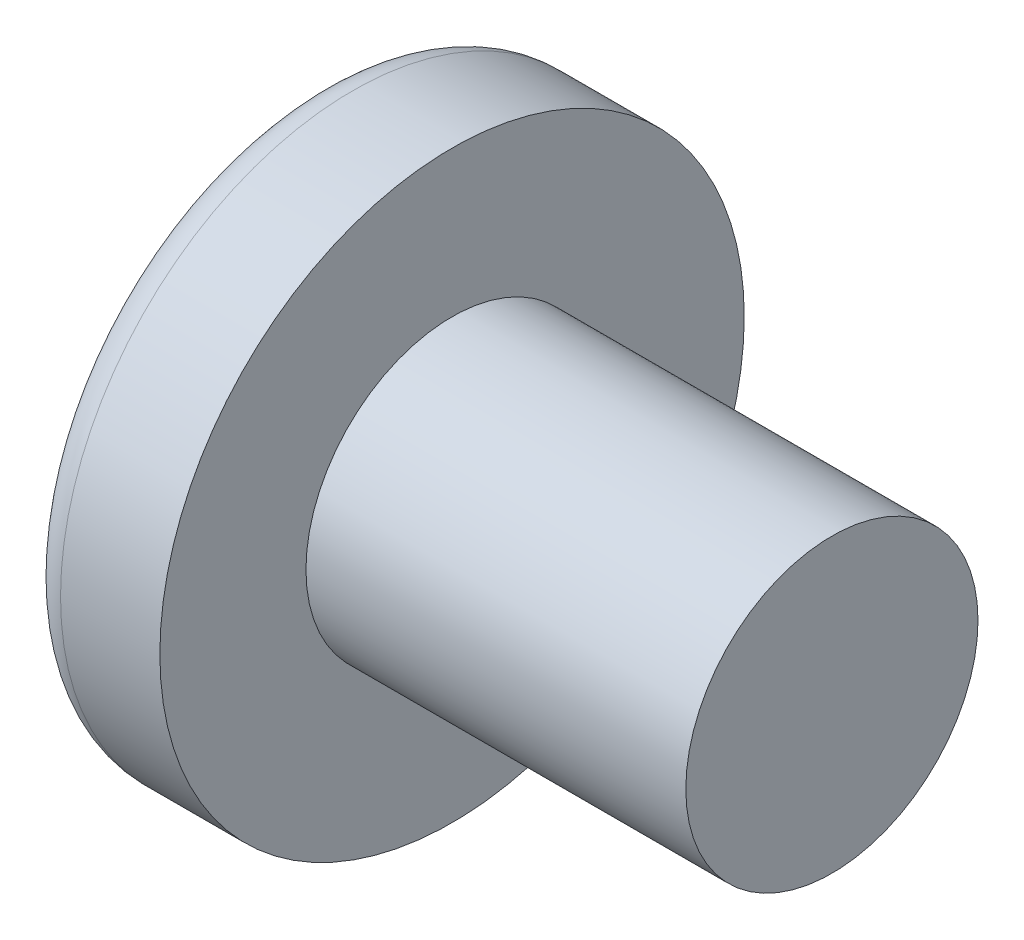
ISO-10303-21;
HEADER;
FILE_DESCRIPTION(('STEP AP214'),'2;1');
FILE_NAME('part.step','',(''),(''),'','','');
FILE_SCHEMA(('AUTOMOTIVE_DESIGN { 1 0 10303 214 1 1 1 1 }'));
ENDSEC;
DATA;
#1=APPLICATION_CONTEXT('core data for automotive mechanical design processes');
#2=APPLICATION_PROTOCOL_DEFINITION('international standard','automotive_design',2000,#1);
#3=PRODUCT_CONTEXT('',#1,'mechanical');
#4=PRODUCT('Part','Part','',(#3));
#5=PRODUCT_RELATED_PRODUCT_CATEGORY('part','',(#4));
#6=PRODUCT_DEFINITION_FORMATION('','',#4);
#7=PRODUCT_DEFINITION_CONTEXT('part definition',#1,'design');
#8=PRODUCT_DEFINITION('design','',#6,#7);
#9=PRODUCT_DEFINITION_SHAPE('','',#8);
#10=(LENGTH_UNIT() NAMED_UNIT(*) SI_UNIT(.MILLI.,.METRE.));
#11=(NAMED_UNIT(*) PLANE_ANGLE_UNIT() SI_UNIT($,.RADIAN.));
#12=(NAMED_UNIT(*) SI_UNIT($,.STERADIAN.) SOLID_ANGLE_UNIT());
#13=UNCERTAINTY_MEASURE_WITH_UNIT(LENGTH_MEASURE(1.E-05),#10,'distance_accuracy_value','');
#14=(GEOMETRIC_REPRESENTATION_CONTEXT(3) GLOBAL_UNCERTAINTY_ASSIGNED_CONTEXT((#13)) GLOBAL_UNIT_ASSIGNED_CONTEXT((#10,
#11,#12)) REPRESENTATION_CONTEXT('',''));
#15=CARTESIAN_POINT('',(0.,0.,0.));
#16=DIRECTION('',(0.,0.,1.));
#17=DIRECTION('',(1.,0.,0.));
#18=AXIS2_PLACEMENT_3D('',#15,#16,#17);
#19=CARTESIAN_POINT('',(16.,0.,0.));
#20=DIRECTION('',(-1.,0.,0.));
#21=DIRECTION('',(0.,1.,0.));
#22=AXIS2_PLACEMENT_3D('',#19,#20,#21);
#23=SPHERICAL_SURFACE('',#22,16.);
#24=CARTESIAN_POINT('',(3.1355893789029,0.,0.));
#25=DIRECTION('',(-1.,0.,0.));
#26=DIRECTION('',(0.,0.,1.));
#27=AXIS2_PLACEMENT_3D('',#24,#25,#26);
#28=CIRCLE('',#27,9.51351351351351);
#29=CARTESIAN_POINT('',(3.1355893789029,0.,9.51351351351351));
#30=VERTEX_POINT('',#29);
#31=EDGE_CURVE('E152',#30,#30,#28,.T.);
#32=ORIENTED_EDGE('',*,*,#31,.T.);
#33=EDGE_LOOP('',(#32));
#34=FACE_BOUND('',#33,.T.);
#35=CARTESIAN_POINT('',(15.9783292627018,-0.286901717708185,0.));
#36=DIRECTION('',(-0.0753191069988102,-0.997159481788596,0.));
#37=DIRECTION('',(0.997159481788596,-0.0753191069988102,0.));
#38=AXIS2_PLACEMENT_3D('',#35,#36,#37);
#39=CIRCLE('',#38,15.9974128465674);
#40=CARTESIAN_POINT('',(0.689797493113337,0.867897069485676,4.56557267764947));
#41=VERTEX_POINT('',#40);
#42=CARTESIAN_POINT('',(0.0525309152497253,0.916032147616602,0.916032147616605));
#43=VERTEX_POINT('',#42);
#44=EDGE_CURVE('E183',#41,#43,#39,.T.);
#45=ORIENTED_EDGE('',*,*,#44,.F.);
#46=CARTESIAN_POINT('',(12.5917266638189,0.,-4.48302043571123));
#47=DIRECTION('',(0.605215831317699,0.,0.796061428234295));
#48=DIRECTION('',(0.796061428234295,0.,-0.605215831317699));
#49=AXIS2_PLACEMENT_3D('',#46,#47,#48);
#50=CIRCLE('',#49,14.9761877872465);
#51=CARTESIAN_POINT('',(0.689797493113337,-0.867897069485708,4.56557267764947));
#52=VERTEX_POINT('',#51);
#53=EDGE_CURVE('E148',#41,#52,#50,.T.);
#54=ORIENTED_EDGE('',*,*,#53,.T.);
#55=CARTESIAN_POINT('',(15.9783292627018,0.286901717708185,0.));
#56=DIRECTION('',(-0.0753191069988102,0.997159481788596,0.));
#57=DIRECTION('',(-0.997159481788596,-0.0753191069988102,0.));
#58=AXIS2_PLACEMENT_3D('',#55,#56,#57);
#59=CIRCLE('',#58,15.9974128465674);
#60=CARTESIAN_POINT('',(0.0525309152497253,-0.916032147616608,0.916032147616605));
#61=VERTEX_POINT('',#60);
#62=EDGE_CURVE('E104',#61,#52,#59,.T.);
#63=ORIENTED_EDGE('',*,*,#62,.F.);
#64=CARTESIAN_POINT('',(15.9783292627018,0.,-0.286901717708185));
#65=DIRECTION('',(-0.0753191069988102,0.,-0.997159481788596));
#66=DIRECTION('',(-0.997159481788596,0.,0.0753191069988102));
#67=AXIS2_PLACEMENT_3D('',#64,#65,#66);
#68=CIRCLE('',#67,15.9974128465674);
#69=CARTESIAN_POINT('',(0.689797493113334,-4.56557267764947,0.867897069485691));
#70=VERTEX_POINT('',#69);
#71=EDGE_CURVE('E129',#70,#61,#68,.T.);
#72=ORIENTED_EDGE('',*,*,#71,.F.);
#73=CARTESIAN_POINT('',(12.5917266638189,4.48302043571123,0.));
#74=DIRECTION('',(0.605215831317699,-0.796061428234295,0.));
#75=DIRECTION('',(0.796061428234295,0.605215831317699,0.));
#76=AXIS2_PLACEMENT_3D('',#73,#74,#75);
#77=CIRCLE('',#76,14.9761877872465);
#78=CARTESIAN_POINT('',(0.689797493113334,-4.56557267764947,-0.867897069485692));
#79=VERTEX_POINT('',#78);
#80=EDGE_CURVE('E137',#70,#79,#77,.T.);
#81=ORIENTED_EDGE('',*,*,#80,.T.);
#82=CARTESIAN_POINT('',(15.9783292627018,0.,0.286901717708185));
#83=DIRECTION('',(-0.0753191069988102,0.,0.997159481788596));
#84=DIRECTION('',(0.997159481788596,0.,0.0753191069988102));
#85=AXIS2_PLACEMENT_3D('',#82,#83,#84);
#86=CIRCLE('',#85,15.9974128465674);
#87=CARTESIAN_POINT('',(0.0525309152497253,-0.916032147616602,-0.916032147616605));
#88=VERTEX_POINT('',#87);
#89=EDGE_CURVE('E47',#88,#79,#86,.T.);
#90=ORIENTED_EDGE('',*,*,#89,.F.);
#91=CARTESIAN_POINT('',(0.689797493113334,-0.867897069485676,-4.56557267764947));
#92=VERTEX_POINT('',#91);
#93=EDGE_CURVE('E190',#92,#88,#59,.T.);
#94=ORIENTED_EDGE('',*,*,#93,.F.);
#95=CARTESIAN_POINT('',(12.5917266638189,0.,4.48302043571123));
#96=DIRECTION('',(0.605215831317699,0.,-0.796061428234295));
#97=DIRECTION('',(-0.796061428234295,0.,-0.605215831317699));
#98=AXIS2_PLACEMENT_3D('',#95,#96,#97);
#99=CIRCLE('',#98,14.9761877872465);
#100=CARTESIAN_POINT('',(0.689797493113334,0.867897069485708,-4.56557267764947));
#101=VERTEX_POINT('',#100);
#102=EDGE_CURVE('E130',#92,#101,#99,.T.);
#103=ORIENTED_EDGE('',*,*,#102,.T.);
#104=CARTESIAN_POINT('',(0.0525309152497253,0.916032147616609,-0.916032147616605));
#105=VERTEX_POINT('',#104);
#106=EDGE_CURVE('E178',#105,#101,#39,.T.);
#107=ORIENTED_EDGE('',*,*,#106,.F.);
#108=CARTESIAN_POINT('',(0.689797493113337,4.56557267764947,-0.867897069485692));
#109=VERTEX_POINT('',#108);
#110=EDGE_CURVE('E40',#109,#105,#86,.T.);
#111=ORIENTED_EDGE('',*,*,#110,.F.);
#112=CARTESIAN_POINT('',(12.5917266638189,-4.48302043571123,0.));
#113=DIRECTION('',(0.605215831317699,0.796061428234295,0.));
#114=DIRECTION('',(-0.796061428234295,0.605215831317699,0.));
#115=AXIS2_PLACEMENT_3D('',#112,#113,#114);
#116=CIRCLE('',#115,14.9761877872465);
#117=CARTESIAN_POINT('',(0.689797493113337,4.56557267764947,0.867897069485692));
#118=VERTEX_POINT('',#117);
#119=EDGE_CURVE('E11',#109,#118,#116,.T.);
#120=ORIENTED_EDGE('',*,*,#119,.T.);
#121=EDGE_CURVE('E166',#43,#118,#68,.T.);
#122=ORIENTED_EDGE('',*,*,#121,.F.);
#123=EDGE_LOOP('',(#45,#54,#63,#72,#81,#90,#94,#103,#107,#111,#120,#122));
#124=FACE_BOUND('',#123,.T.);
#125=ADVANCED_FACE('F32',(#34,#124),#23,.T.);
#126=CARTESIAN_POINT('',(6.69505399568034,0.,-0.414298056155508));
#127=DIRECTION('',(-0.0753191069988102,0.,0.997159481788596));
#128=DIRECTION('',(0.997159481788596,0.,0.0753191069988102));
#129=AXIS2_PLACEMENT_3D('',#126,#127,#128);
#130=PLANE('',#129);
#131=ORIENTED_EDGE('',*,*,#110,.T.);
#132=DIRECTION('',(0.994343032504054,-0.0751063702712425,0.0751063702712422));
#133=VECTOR('',#132,1.);
#134=CARTESIAN_POINT('',(6.72599439429394,0.411961014552512,-0.411961014552511));
#135=LINE('',#134,#133);
#136=CARTESIAN_POINT('',(6.09,0.460000000000002,-0.459999999999998));
#137=VERTEX_POINT('',#136);
#138=EDGE_CURVE('E172',#105,#137,#135,.T.);
#139=ORIENTED_EDGE('',*,*,#138,.T.);
#140=DIRECTION('',(0.794626219349906,-0.60412469549919,0.0600210280625545));
#141=VECTOR('',#140,1.);
#142=CARTESIAN_POINT('',(0.,5.09,-0.92));
#143=LINE('',#142,#141);
#144=EDGE_CURVE('E153',#109,#137,#143,.T.);
#145=ORIENTED_EDGE('',*,*,#144,.F.);
#146=EDGE_LOOP('',(#131,#139,#145));
#147=FACE_BOUND('',#146,.T.);
#148=ADVANCED_FACE('F171',(#147),#130,.T.);
#149=DIRECTION('',(0.794626219349906,0.60412469549919,0.0600210280625545));
#150=VECTOR('',#149,1.);
#151=CARTESIAN_POINT('',(0.,-5.09,-0.92));
#152=LINE('',#151,#150);
#153=CARTESIAN_POINT('',(6.09,-0.46,-0.46));
#154=VERTEX_POINT('',#153);
#155=EDGE_CURVE('E138',#79,#154,#152,.T.);
#156=ORIENTED_EDGE('',*,*,#155,.T.);
#157=DIRECTION('',(-0.994343032504054,-0.0751063702712418,-0.0751063702712422));
#158=VECTOR('',#157,1.);
#159=CARTESIAN_POINT('',(6.72599439429394,-0.411961014552509,-0.411961014552511));
#160=LINE('',#159,#158);
#161=EDGE_CURVE('E193',#154,#88,#160,.T.);
#162=ORIENTED_EDGE('',*,*,#161,.T.);
#163=ORIENTED_EDGE('',*,*,#89,.T.);
#164=EDGE_LOOP('',(#156,#162,#163));
#165=FACE_BOUND('',#164,.T.);
#166=ADVANCED_FACE('F208',(#165),#130,.T.);
#167=CARTESIAN_POINT('',(6.69505399568034,0.,0.414298056155508));
#168=DIRECTION('',(-0.0753191069988102,0.,-0.997159481788596));
#169=DIRECTION('',(-0.997159481788596,0.,0.0753191069988102));
#170=AXIS2_PLACEMENT_3D('',#167,#168,#169);
#171=PLANE('',#170);
#172=DIRECTION('',(0.794626219349906,-0.60412469549919,-0.0600210280625545));
#173=VECTOR('',#172,1.);
#174=CARTESIAN_POINT('',(0.,5.09,0.92));
#175=LINE('',#174,#173);
#176=CARTESIAN_POINT('',(6.09,0.460000000000001,0.46));
#177=VERTEX_POINT('',#176);
#178=EDGE_CURVE('E209',#118,#177,#175,.T.);
#179=ORIENTED_EDGE('',*,*,#178,.T.);
#180=DIRECTION('',(-0.994343032504054,0.0751063702712419,0.0751063702712421));
#181=VECTOR('',#180,1.);
#182=CARTESIAN_POINT('',(6.72599439429394,0.411961014552509,0.411961014552511));
#183=LINE('',#182,#181);
#184=EDGE_CURVE('E187',#177,#43,#183,.T.);
#185=ORIENTED_EDGE('',*,*,#184,.T.);
#186=ORIENTED_EDGE('',*,*,#121,.T.);
#187=EDGE_LOOP('',(#179,#185,#186));
#188=FACE_BOUND('',#187,.T.);
#189=ADVANCED_FACE('F213',(#188),#171,.T.);
#190=ORIENTED_EDGE('',*,*,#71,.T.);
#191=DIRECTION('',(0.994343032504054,0.0751063702712424,-0.0751063702712421));
#192=VECTOR('',#191,1.);
#193=CARTESIAN_POINT('',(6.72599439429394,-0.411961014552512,0.41196101455251));
#194=LINE('',#193,#192);
#195=CARTESIAN_POINT('',(6.09,-0.460000000000002,0.459999999999999));
#196=VERTEX_POINT('',#195);
#197=EDGE_CURVE('E102',#61,#196,#194,.T.);
#198=ORIENTED_EDGE('',*,*,#197,.T.);
#199=DIRECTION('',(0.794626219349906,0.60412469549919,-0.0600210280625544));
#200=VECTOR('',#199,1.);
#201=CARTESIAN_POINT('',(0.,-5.09,0.919999999999999));
#202=LINE('',#201,#200);
#203=EDGE_CURVE('E127',#70,#196,#202,.T.);
#204=ORIENTED_EDGE('',*,*,#203,.F.);
#205=EDGE_LOOP('',(#190,#198,#204));
#206=FACE_BOUND('',#205,.T.);
#207=ADVANCED_FACE('F126',(#206),#171,.T.);
#208=CARTESIAN_POINT('',(-25.4,0.,0.));
#209=DIRECTION('',(-1.,0.,0.));
#210=DIRECTION('',(0.,0.,1.));
#211=AXIS2_PLACEMENT_3D('',#208,#209,#210);
#212=CYLINDRICAL_SURFACE('',#211,5.);
#213=CARTESIAN_POINT('',(20.5,0.,0.));
#214=DIRECTION('',(-1.,0.,0.));
#215=DIRECTION('',(0.,0.,1.));
#216=AXIS2_PLACEMENT_3D('',#213,#214,#215);
#217=CIRCLE('',#216,5.);
#218=CARTESIAN_POINT('',(20.5,0.,5.));
#219=VERTEX_POINT('',#218);
#220=EDGE_CURVE('E149',#219,#219,#217,.T.);
#221=ORIENTED_EDGE('',*,*,#220,.T.);
#222=EDGE_LOOP('',(#221));
#223=FACE_BOUND('',#222,.T.);
#224=CARTESIAN_POINT('',(7.5,0.,0.));
#225=DIRECTION('',(-1.,0.,0.));
#226=DIRECTION('',(0.,0.,1.));
#227=AXIS2_PLACEMENT_3D('',#224,#225,#226);
#228=CIRCLE('',#227,5.);
#229=CARTESIAN_POINT('',(7.5,0.,5.));
#230=VERTEX_POINT('',#229);
#231=EDGE_CURVE('E162',#230,#230,#228,.T.);
#232=ORIENTED_EDGE('',*,*,#231,.F.);
#233=EDGE_LOOP('',(#232));
#234=FACE_BOUND('',#233,.T.);
#235=ADVANCED_FACE('F34',(#223,#234),#212,.T.);
#236=CARTESIAN_POINT('',(7.5,5.,0.));
#237=DIRECTION('',(-1.,0.,0.));
#238=DIRECTION('',(0.,0.,1.));
#239=AXIS2_PLACEMENT_3D('',#236,#237,#238);
#240=PLANE('',#239);
#241=CARTESIAN_POINT('',(7.5,0.,0.));
#242=DIRECTION('',(-1.,0.,0.));
#243=DIRECTION('',(0.,0.,1.));
#244=AXIS2_PLACEMENT_3D('',#241,#242,#243);
#245=CIRCLE('',#244,10.);
#246=CARTESIAN_POINT('',(7.5,0.,10.));
#247=VERTEX_POINT('',#246);
#248=EDGE_CURVE('E159',#247,#247,#245,.T.);
#249=ORIENTED_EDGE('',*,*,#248,.F.);
#250=EDGE_LOOP('',(#249));
#251=FACE_BOUND('',#250,.T.);
#252=ORIENTED_EDGE('',*,*,#231,.T.);
#253=EDGE_LOOP('',(#252));
#254=FACE_BOUND('',#253,.T.);
#255=ADVANCED_FACE('F241',(#251,#254),#240,.F.);
#256=CARTESIAN_POINT('',(-25.4,0.,0.));
#257=DIRECTION('',(-1.,0.,0.));
#258=DIRECTION('',(0.,0.,1.));
#259=AXIS2_PLACEMENT_3D('',#256,#257,#258);
#260=CYLINDRICAL_SURFACE('',#259,10.);
#261=ORIENTED_EDGE('',*,*,#248,.T.);
#262=EDGE_LOOP('',(#261));
#263=FACE_BOUND('',#262,.T.);
#264=CARTESIAN_POINT('',(4.10042017548519,0.,0.));
#265=DIRECTION('',(-1.,0.,0.));
#266=DIRECTION('',(0.,0.,1.));
#267=AXIS2_PLACEMENT_3D('',#264,#265,#266);
#268=CIRCLE('',#267,10.);
#269=CARTESIAN_POINT('',(4.10042017548519,0.,10.));
#270=VERTEX_POINT('',#269);
#271=EDGE_CURVE('E156',#270,#270,#268,.T.);
#272=ORIENTED_EDGE('',*,*,#271,.F.);
#273=EDGE_LOOP('',(#272));
#274=FACE_BOUND('',#273,.T.);
#275=ADVANCED_FACE('F238',(#263,#274),#260,.T.);
#276=CARTESIAN_POINT('',(4.10042017548519,0.,0.));
#277=DIRECTION('',(-1.,0.,0.));
#278=DIRECTION('',(0.,0.,1.));
#279=AXIS2_PLACEMENT_3D('',#276,#277,#278);
#280=TOROIDAL_SURFACE('',#279,8.8,1.2);
#281=ORIENTED_EDGE('',*,*,#271,.T.);
#282=EDGE_LOOP('',(#281));
#283=FACE_BOUND('',#282,.T.);
#284=ORIENTED_EDGE('',*,*,#31,.F.);
#285=EDGE_LOOP('',(#284));
#286=FACE_BOUND('',#285,.T.);
#287=ADVANCED_FACE('F235',(#283,#286),#280,.T.);
#288=CARTESIAN_POINT('',(20.5,5.,0.));
#289=DIRECTION('',(1.,0.,0.));
#290=DIRECTION('',(0.,0.,-1.));
#291=AXIS2_PLACEMENT_3D('',#288,#289,#290);
#292=PLANE('',#291);
#293=ORIENTED_EDGE('',*,*,#220,.F.);
#294=EDGE_LOOP('',(#293));
#295=FACE_BOUND('',#294,.T.);
#296=ADVANCED_FACE('F233',(#295),#292,.T.);
#297=CARTESIAN_POINT('',(6.09,0.46,0.46));
#298=DIRECTION('',(0.605215831317699,0.796061428234295,0.));
#299=DIRECTION('',(-0.796061428234295,0.605215831317699,0.));
#300=AXIS2_PLACEMENT_3D('',#297,#298,#299);
#301=PLANE('',#300);
#302=ORIENTED_EDGE('',*,*,#144,.T.);
#303=DIRECTION('',(0.,0.,-1.));
#304=VECTOR('',#303,1.);
#305=CARTESIAN_POINT('',(6.09,0.46,0.46));
#306=LINE('',#305,#304);
#307=EDGE_CURVE('E120',#177,#137,#306,.T.);
#308=ORIENTED_EDGE('',*,*,#307,.F.);
#309=ORIENTED_EDGE('',*,*,#178,.F.);
#310=ORIENTED_EDGE('',*,*,#119,.F.);
#311=EDGE_LOOP('',(#302,#308,#309,#310));
#312=FACE_BOUND('',#311,.T.);
#313=ADVANCED_FACE('F212',(#312),#301,.F.);
#314=CARTESIAN_POINT('',(6.09,-0.46,-0.46));
#315=DIRECTION('',(0.605215831317699,-0.796061428234295,0.));
#316=DIRECTION('',(0.796061428234295,0.605215831317699,0.));
#317=AXIS2_PLACEMENT_3D('',#314,#315,#316);
#318=PLANE('',#317);
#319=ORIENTED_EDGE('',*,*,#203,.T.);
#320=DIRECTION('',(0.,0.,1.));
#321=VECTOR('',#320,1.);
#322=CARTESIAN_POINT('',(6.09,-0.46,-0.46));
#323=LINE('',#322,#321);
#324=EDGE_CURVE('E119',#154,#196,#323,.T.);
#325=ORIENTED_EDGE('',*,*,#324,.F.);
#326=ORIENTED_EDGE('',*,*,#155,.F.);
#327=ORIENTED_EDGE('',*,*,#80,.F.);
#328=EDGE_LOOP('',(#319,#325,#326,#327));
#329=FACE_BOUND('',#328,.T.);
#330=ADVANCED_FACE('F134',(#329),#318,.F.);
#331=CARTESIAN_POINT('',(6.09,0.46,-0.46));
#332=DIRECTION('',(-1.,0.,0.));
#333=DIRECTION('',(0.,0.,1.));
#334=AXIS2_PLACEMENT_3D('',#331,#332,#333);
#335=PLANE('',#334);
#336=DIRECTION('',(0.,1.,0.));
#337=VECTOR('',#336,1.);
#338=CARTESIAN_POINT('',(6.09,-0.46,-0.46));
#339=LINE('',#338,#337);
#340=EDGE_CURVE('E142',#154,#137,#339,.T.);
#341=ORIENTED_EDGE('',*,*,#340,.F.);
#342=ORIENTED_EDGE('',*,*,#324,.T.);
#343=DIRECTION('',(0.,-1.,0.));
#344=VECTOR('',#343,1.);
#345=CARTESIAN_POINT('',(6.09,0.46,0.46));
#346=LINE('',#345,#344);
#347=EDGE_CURVE('E111',#177,#196,#346,.T.);
#348=ORIENTED_EDGE('',*,*,#347,.F.);
#349=ORIENTED_EDGE('',*,*,#307,.T.);
#350=EDGE_LOOP('',(#341,#342,#348,#349));
#351=FACE_BOUND('',#350,.T.);
#352=ADVANCED_FACE('F140',(#351),#335,.T.);
#353=CARTESIAN_POINT('',(6.09,0.460000000000002,-0.459999999999998));
#354=DIRECTION('',(0.605215831317699,0.,-0.796061428234295));
#355=DIRECTION('',(0.796061428234295,0.,0.605215831317699));
#356=AXIS2_PLACEMENT_3D('',#353,#354,#355);
#357=PLANE('',#356);
#358=DIRECTION('',(0.794626219349906,0.0600210280625523,0.60412469549919));
#359=VECTOR('',#358,1.);
#360=CARTESIAN_POINT('',(0.,-0.919999999999981,-5.09));
#361=LINE('',#360,#359);
#362=EDGE_CURVE('E198',#92,#154,#361,.T.);
#363=ORIENTED_EDGE('',*,*,#362,.T.);
#364=ORIENTED_EDGE('',*,*,#340,.T.);
#365=DIRECTION('',(0.794626219349906,-0.0600210280625566,0.604124695499189));
#366=VECTOR('',#365,1.);
#367=CARTESIAN_POINT('',(0.,0.920000000000018,-5.09));
#368=LINE('',#367,#366);
#369=EDGE_CURVE('E108',#101,#137,#368,.T.);
#370=ORIENTED_EDGE('',*,*,#369,.F.);
#371=ORIENTED_EDGE('',*,*,#102,.F.);
#372=EDGE_LOOP('',(#363,#364,#370,#371));
#373=FACE_BOUND('',#372,.T.);
#374=ADVANCED_FACE('F203',(#373),#357,.F.);
#375=CARTESIAN_POINT('',(6.69505399568034,-0.414298056155508,0.));
#376=DIRECTION('',(-0.0753191069988102,0.997159481788596,0.));
#377=DIRECTION('',(-0.997159481788596,-0.0753191069988102,0.));
#378=AXIS2_PLACEMENT_3D('',#375,#376,#377);
#379=PLANE('',#378);
#380=ORIENTED_EDGE('',*,*,#93,.T.);
#381=ORIENTED_EDGE('',*,*,#161,.F.);
#382=ORIENTED_EDGE('',*,*,#362,.F.);
#383=EDGE_LOOP('',(#380,#381,#382));
#384=FACE_BOUND('',#383,.T.);
#385=ADVANCED_FACE('F207',(#384),#379,.T.);
#386=CARTESIAN_POINT('',(6.69505399568034,0.414298056155508,0.));
#387=DIRECTION('',(-0.0753191069988102,-0.997159481788596,0.));
#388=DIRECTION('',(0.997159481788596,-0.0753191069988102,0.));
#389=AXIS2_PLACEMENT_3D('',#386,#387,#388);
#390=PLANE('',#389);
#391=ORIENTED_EDGE('',*,*,#106,.T.);
#392=ORIENTED_EDGE('',*,*,#369,.T.);
#393=ORIENTED_EDGE('',*,*,#138,.F.);
#394=EDGE_LOOP('',(#391,#392,#393));
#395=FACE_BOUND('',#394,.T.);
#396=ADVANCED_FACE('F201',(#395),#390,.T.);
#397=CARTESIAN_POINT('',(6.09,-0.460000000000002,0.459999999999998));
#398=DIRECTION('',(0.605215831317699,0.,0.796061428234295));
#399=DIRECTION('',(-0.796061428234295,0.,0.605215831317699));
#400=AXIS2_PLACEMENT_3D('',#397,#398,#399);
#401=PLANE('',#400);
#402=DIRECTION('',(0.794626219349906,-0.0600210280625524,-0.60412469549919));
#403=VECTOR('',#402,1.);
#404=CARTESIAN_POINT('',(0.,0.919999999999982,5.09));
#405=LINE('',#404,#403);
#406=EDGE_CURVE('E107',#41,#177,#405,.T.);
#407=ORIENTED_EDGE('',*,*,#406,.T.);
#408=ORIENTED_EDGE('',*,*,#347,.T.);
#409=DIRECTION('',(0.794626219349906,0.0600210280625566,-0.604124695499189));
#410=VECTOR('',#409,1.);
#411=CARTESIAN_POINT('',(0.,-0.920000000000018,5.09));
#412=LINE('',#411,#410);
#413=EDGE_CURVE('E98',#52,#196,#412,.T.);
#414=ORIENTED_EDGE('',*,*,#413,.F.);
#415=ORIENTED_EDGE('',*,*,#53,.F.);
#416=EDGE_LOOP('',(#407,#408,#414,#415));
#417=FACE_BOUND('',#416,.T.);
#418=ADVANCED_FACE('F112',(#417),#401,.F.);
#419=ORIENTED_EDGE('',*,*,#44,.T.);
#420=ORIENTED_EDGE('',*,*,#184,.F.);
#421=ORIENTED_EDGE('',*,*,#406,.F.);
#422=EDGE_LOOP('',(#419,#420,#421));
#423=FACE_BOUND('',#422,.T.);
#424=ADVANCED_FACE('F214',(#423),#390,.T.);
#425=ORIENTED_EDGE('',*,*,#62,.T.);
#426=ORIENTED_EDGE('',*,*,#413,.T.);
#427=ORIENTED_EDGE('',*,*,#197,.F.);
#428=EDGE_LOOP('',(#425,#426,#427));
#429=FACE_BOUND('',#428,.T.);
#430=ADVANCED_FACE('F100',(#429),#379,.T.);
#431=CLOSED_SHELL('',(#125,#148,#166,#189,#207,#235,#255,#275,#287,#296,#313,#330,#352,#374,
#385,#396,#418,#424,#430));
#432=MANIFOLD_SOLID_BREP('B2',#431);
#433=ADVANCED_BREP_SHAPE_REPRESENTATION('',(#18,#432),#14);
#434=SHAPE_DEFINITION_REPRESENTATION(#9,#433);
ENDSEC;
END-ISO-10303-21;
